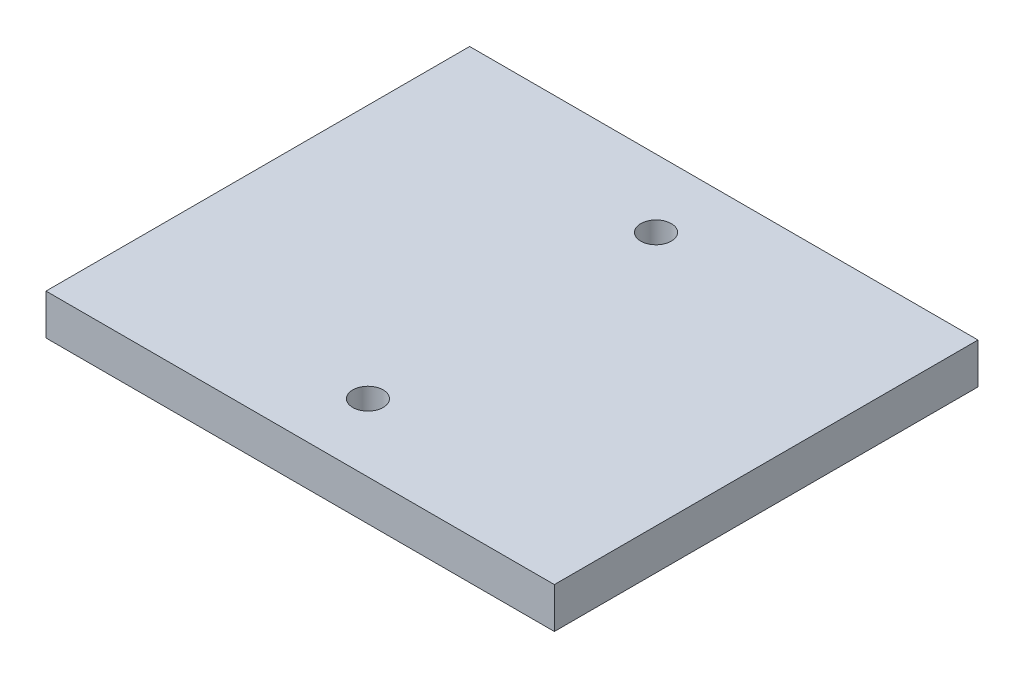
ISO-10303-21;
HEADER;
FILE_DESCRIPTION(('STEP AP214'),'2;1');
FILE_NAME('part.step','',(''),(''),'','','');
FILE_SCHEMA(('AUTOMOTIVE_DESIGN { 1 0 10303 214 1 1 1 1 }'));
ENDSEC;
DATA;
#1=APPLICATION_CONTEXT('core data for automotive mechanical design processes');
#2=APPLICATION_PROTOCOL_DEFINITION('international standard','automotive_design',2000,#1);
#3=PRODUCT_CONTEXT('',#1,'mechanical');
#4=PRODUCT('Part','Part','',(#3));
#5=PRODUCT_RELATED_PRODUCT_CATEGORY('part','',(#4));
#6=PRODUCT_DEFINITION_FORMATION('','',#4);
#7=PRODUCT_DEFINITION_CONTEXT('part definition',#1,'design');
#8=PRODUCT_DEFINITION('design','',#6,#7);
#9=PRODUCT_DEFINITION_SHAPE('','',#8);
#10=(LENGTH_UNIT() NAMED_UNIT(*) SI_UNIT(.MILLI.,.METRE.));
#11=(NAMED_UNIT(*) PLANE_ANGLE_UNIT() SI_UNIT($,.RADIAN.));
#12=(NAMED_UNIT(*) SI_UNIT($,.STERADIAN.) SOLID_ANGLE_UNIT());
#13=UNCERTAINTY_MEASURE_WITH_UNIT(LENGTH_MEASURE(1.E-05),#10,'distance_accuracy_value','');
#14=(GEOMETRIC_REPRESENTATION_CONTEXT(3) GLOBAL_UNCERTAINTY_ASSIGNED_CONTEXT((#13)) GLOBAL_UNIT_ASSIGNED_CONTEXT((#10,
#11,#12)) REPRESENTATION_CONTEXT('',''));
#15=CARTESIAN_POINT('',(0.,0.,0.));
#16=DIRECTION('',(0.,0.,1.));
#17=DIRECTION('',(1.,0.,0.));
#18=AXIS2_PLACEMENT_3D('',#15,#16,#17);
#19=CARTESIAN_POINT('',(0.,12.,0.));
#20=DIRECTION('',(0.,-1.,0.));
#21=DIRECTION('',(0.,0.,-1.));
#22=AXIS2_PLACEMENT_3D('',#19,#20,#21);
#23=PLANE('',#22);
#24=DIRECTION('',(0.,0.,-1.));
#25=VECTOR('',#24,1.);
#26=CARTESIAN_POINT('',(75.,12.,62.5));
#27=LINE('',#26,#25);
#28=CARTESIAN_POINT('',(75.,12.,62.5));
#29=VERTEX_POINT('',#28);
#30=CARTESIAN_POINT('',(75.,12.,-62.5));
#31=VERTEX_POINT('',#30);
#32=EDGE_CURVE('E98',#29,#31,#27,.T.);
#33=ORIENTED_EDGE('',*,*,#32,.T.);
#34=DIRECTION('',(-1.,0.,0.));
#35=VECTOR('',#34,1.);
#36=CARTESIAN_POINT('',(-75.,12.,-62.5));
#37=LINE('',#36,#35);
#38=CARTESIAN_POINT('',(-75.,12.,-62.5));
#39=VERTEX_POINT('',#38);
#40=EDGE_CURVE('E93',#31,#39,#37,.T.);
#41=ORIENTED_EDGE('',*,*,#40,.T.);
#42=DIRECTION('',(0.,0.,1.));
#43=VECTOR('',#42,1.);
#44=CARTESIAN_POINT('',(-75.,12.,62.5));
#45=LINE('',#44,#43);
#46=CARTESIAN_POINT('',(-75.,12.,62.5));
#47=VERTEX_POINT('',#46);
#48=EDGE_CURVE('E96',#39,#47,#45,.T.);
#49=ORIENTED_EDGE('',*,*,#48,.T.);
#50=DIRECTION('',(1.,0.,0.));
#51=VECTOR('',#50,1.);
#52=CARTESIAN_POINT('',(-75.,12.,62.5));
#53=LINE('',#52,#51);
#54=EDGE_CURVE('E63',#47,#29,#53,.T.);
#55=ORIENTED_EDGE('',*,*,#54,.T.);
#56=EDGE_LOOP('',(#33,#41,#49,#55));
#57=FACE_BOUND('',#56,.T.);
#58=CARTESIAN_POINT('',(0.,12.,-42.5));
#59=DIRECTION('',(0.,1.,0.));
#60=DIRECTION('',(0.,0.,1.));
#61=AXIS2_PLACEMENT_3D('',#58,#59,#60);
#62=CIRCLE('',#61,4.5);
#63=CARTESIAN_POINT('',(0.,12.,-38.));
#64=VERTEX_POINT('',#63);
#65=EDGE_CURVE('E118',#64,#64,#62,.T.);
#66=ORIENTED_EDGE('',*,*,#65,.F.);
#67=EDGE_LOOP('',(#66));
#68=FACE_BOUND('',#67,.T.);
#69=CARTESIAN_POINT('',(0.,12.,42.5));
#70=DIRECTION('',(0.,1.,0.));
#71=DIRECTION('',(0.,0.,1.));
#72=AXIS2_PLACEMENT_3D('',#69,#70,#71);
#73=CIRCLE('',#72,4.5);
#74=CARTESIAN_POINT('',(0.,12.,47.));
#75=VERTEX_POINT('',#74);
#76=EDGE_CURVE('E140',#75,#75,#73,.T.);
#77=ORIENTED_EDGE('',*,*,#76,.F.);
#78=EDGE_LOOP('',(#77));
#79=FACE_BOUND('',#78,.T.);
#80=ADVANCED_FACE('F45',(#57,#68,#79),#23,.F.);
#81=CARTESIAN_POINT('',(0.,0.,0.));
#82=DIRECTION('',(0.,-1.,0.));
#83=DIRECTION('',(0.,0.,-1.));
#84=AXIS2_PLACEMENT_3D('',#81,#82,#83);
#85=PLANE('',#84);
#86=CARTESIAN_POINT('',(0.,0.,-42.5));
#87=DIRECTION('',(0.,1.,0.));
#88=DIRECTION('',(0.,0.,1.));
#89=AXIS2_PLACEMENT_3D('',#86,#87,#88);
#90=CIRCLE('',#89,4.5);
#91=CARTESIAN_POINT('',(0.,0.,-38.));
#92=VERTEX_POINT('',#91);
#93=EDGE_CURVE('E136',#92,#92,#90,.T.);
#94=ORIENTED_EDGE('',*,*,#93,.T.);
#95=EDGE_LOOP('',(#94));
#96=FACE_BOUND('',#95,.T.);
#97=DIRECTION('',(0.,0.,-1.));
#98=VECTOR('',#97,1.);
#99=CARTESIAN_POINT('',(75.,0.,62.5));
#100=LINE('',#99,#98);
#101=CARTESIAN_POINT('',(75.,0.,62.5));
#102=VERTEX_POINT('',#101);
#103=CARTESIAN_POINT('',(75.,0.,-62.5));
#104=VERTEX_POINT('',#103);
#105=EDGE_CURVE('E114',#102,#104,#100,.T.);
#106=ORIENTED_EDGE('',*,*,#105,.F.);
#107=DIRECTION('',(1.,0.,0.));
#108=VECTOR('',#107,1.);
#109=CARTESIAN_POINT('',(-75.,0.,62.5));
#110=LINE('',#109,#108);
#111=CARTESIAN_POINT('',(-75.,0.,62.5));
#112=VERTEX_POINT('',#111);
#113=EDGE_CURVE('E86',#112,#102,#110,.T.);
#114=ORIENTED_EDGE('',*,*,#113,.F.);
#115=DIRECTION('',(0.,0.,1.));
#116=VECTOR('',#115,1.);
#117=CARTESIAN_POINT('',(-75.,0.,62.5));
#118=LINE('',#117,#116);
#119=CARTESIAN_POINT('',(-75.,0.,-62.5));
#120=VERTEX_POINT('',#119);
#121=EDGE_CURVE('E80',#120,#112,#118,.T.);
#122=ORIENTED_EDGE('',*,*,#121,.F.);
#123=DIRECTION('',(-1.,0.,0.));
#124=VECTOR('',#123,1.);
#125=CARTESIAN_POINT('',(-75.,0.,-62.5));
#126=LINE('',#125,#124);
#127=EDGE_CURVE('E103',#104,#120,#126,.T.);
#128=ORIENTED_EDGE('',*,*,#127,.F.);
#129=EDGE_LOOP('',(#106,#114,#122,#128));
#130=FACE_BOUND('',#129,.T.);
#131=CARTESIAN_POINT('',(0.,0.,42.5));
#132=DIRECTION('',(0.,1.,0.));
#133=DIRECTION('',(0.,0.,1.));
#134=AXIS2_PLACEMENT_3D('',#131,#132,#133);
#135=CIRCLE('',#134,4.5);
#136=CARTESIAN_POINT('',(0.,0.,47.));
#137=VERTEX_POINT('',#136);
#138=EDGE_CURVE('E144',#137,#137,#135,.T.);
#139=ORIENTED_EDGE('',*,*,#138,.T.);
#140=EDGE_LOOP('',(#139));
#141=FACE_BOUND('',#140,.T.);
#142=ADVANCED_FACE('F131',(#96,#130,#141),#85,.T.);
#143=CARTESIAN_POINT('',(75.,12.,62.5));
#144=DIRECTION('',(-1.,0.,0.));
#145=DIRECTION('',(0.,0.,1.));
#146=AXIS2_PLACEMENT_3D('',#143,#144,#145);
#147=PLANE('',#146);
#148=ORIENTED_EDGE('',*,*,#105,.T.);
#149=DIRECTION('',(0.,-1.,0.));
#150=VECTOR('',#149,1.);
#151=CARTESIAN_POINT('',(75.,12.,-62.5));
#152=LINE('',#151,#150);
#153=EDGE_CURVE('E11',#31,#104,#152,.T.);
#154=ORIENTED_EDGE('',*,*,#153,.F.);
#155=ORIENTED_EDGE('',*,*,#32,.F.);
#156=DIRECTION('',(0.,-1.,0.));
#157=VECTOR('',#156,1.);
#158=CARTESIAN_POINT('',(75.,12.,62.5));
#159=LINE('',#158,#157);
#160=EDGE_CURVE('E110',#29,#102,#159,.T.);
#161=ORIENTED_EDGE('',*,*,#160,.T.);
#162=EDGE_LOOP('',(#148,#154,#155,#161));
#163=FACE_BOUND('',#162,.T.);
#164=ADVANCED_FACE('F47',(#163),#147,.F.);
#165=CARTESIAN_POINT('',(-75.,12.,-62.5));
#166=DIRECTION('',(0.,0.,1.));
#167=DIRECTION('',(1.,0.,0.));
#168=AXIS2_PLACEMENT_3D('',#165,#166,#167);
#169=PLANE('',#168);
#170=ORIENTED_EDGE('',*,*,#127,.T.);
#171=DIRECTION('',(0.,-1.,0.));
#172=VECTOR('',#171,1.);
#173=CARTESIAN_POINT('',(-75.,12.,-62.5));
#174=LINE('',#173,#172);
#175=EDGE_CURVE('E55',#39,#120,#174,.T.);
#176=ORIENTED_EDGE('',*,*,#175,.F.);
#177=ORIENTED_EDGE('',*,*,#40,.F.);
#178=ORIENTED_EDGE('',*,*,#153,.T.);
#179=EDGE_LOOP('',(#170,#176,#177,#178));
#180=FACE_BOUND('',#179,.T.);
#181=ADVANCED_FACE('F102',(#180),#169,.F.);
#182=CARTESIAN_POINT('',(-75.,12.,62.5));
#183=DIRECTION('',(1.,0.,0.));
#184=DIRECTION('',(0.,0.,-1.));
#185=AXIS2_PLACEMENT_3D('',#182,#183,#184);
#186=PLANE('',#185);
#187=ORIENTED_EDGE('',*,*,#121,.T.);
#188=DIRECTION('',(0.,-1.,0.));
#189=VECTOR('',#188,1.);
#190=CARTESIAN_POINT('',(-75.,12.,62.5));
#191=LINE('',#190,#189);
#192=EDGE_CURVE('E105',#47,#112,#191,.T.);
#193=ORIENTED_EDGE('',*,*,#192,.F.);
#194=ORIENTED_EDGE('',*,*,#48,.F.);
#195=ORIENTED_EDGE('',*,*,#175,.T.);
#196=EDGE_LOOP('',(#187,#193,#194,#195));
#197=FACE_BOUND('',#196,.T.);
#198=ADVANCED_FACE('F106',(#197),#186,.F.);
#199=CARTESIAN_POINT('',(-75.,12.,62.5));
#200=DIRECTION('',(0.,0.,-1.));
#201=DIRECTION('',(-1.,0.,0.));
#202=AXIS2_PLACEMENT_3D('',#199,#200,#201);
#203=PLANE('',#202);
#204=ORIENTED_EDGE('',*,*,#113,.T.);
#205=ORIENTED_EDGE('',*,*,#160,.F.);
#206=ORIENTED_EDGE('',*,*,#54,.F.);
#207=ORIENTED_EDGE('',*,*,#192,.T.);
#208=EDGE_LOOP('',(#204,#205,#206,#207));
#209=FACE_BOUND('',#208,.T.);
#210=ADVANCED_FACE('F128',(#209),#203,.F.);
#211=CARTESIAN_POINT('',(0.,12.,-42.5));
#212=DIRECTION('',(0.,-1.,0.));
#213=DIRECTION('',(0.,0.,-1.));
#214=AXIS2_PLACEMENT_3D('',#211,#212,#213);
#215=CYLINDRICAL_SURFACE('',#214,4.5);
#216=ORIENTED_EDGE('',*,*,#65,.T.);
#217=EDGE_LOOP('',(#216));
#218=FACE_BOUND('',#217,.T.);
#219=ORIENTED_EDGE('',*,*,#93,.F.);
#220=EDGE_LOOP('',(#219));
#221=FACE_BOUND('',#220,.T.);
#222=ADVANCED_FACE('F163',(#218,#221),#215,.F.);
#223=CARTESIAN_POINT('',(0.,12.,42.5));
#224=DIRECTION('',(0.,-1.,0.));
#225=DIRECTION('',(0.,0.,-1.));
#226=AXIS2_PLACEMENT_3D('',#223,#224,#225);
#227=CYLINDRICAL_SURFACE('',#226,4.5);
#228=ORIENTED_EDGE('',*,*,#76,.T.);
#229=EDGE_LOOP('',(#228));
#230=FACE_BOUND('',#229,.T.);
#231=ORIENTED_EDGE('',*,*,#138,.F.);
#232=EDGE_LOOP('',(#231));
#233=FACE_BOUND('',#232,.T.);
#234=ADVANCED_FACE('F152',(#230,#233),#227,.F.);
#235=CLOSED_SHELL('',(#80,#142,#164,#181,#198,#210,#222,#234));
#236=MANIFOLD_SOLID_BREP('B2',#235);
#237=ADVANCED_BREP_SHAPE_REPRESENTATION('',(#18,#236),#14);
#238=SHAPE_DEFINITION_REPRESENTATION(#9,#237);
ENDSEC;
END-ISO-10303-21;
